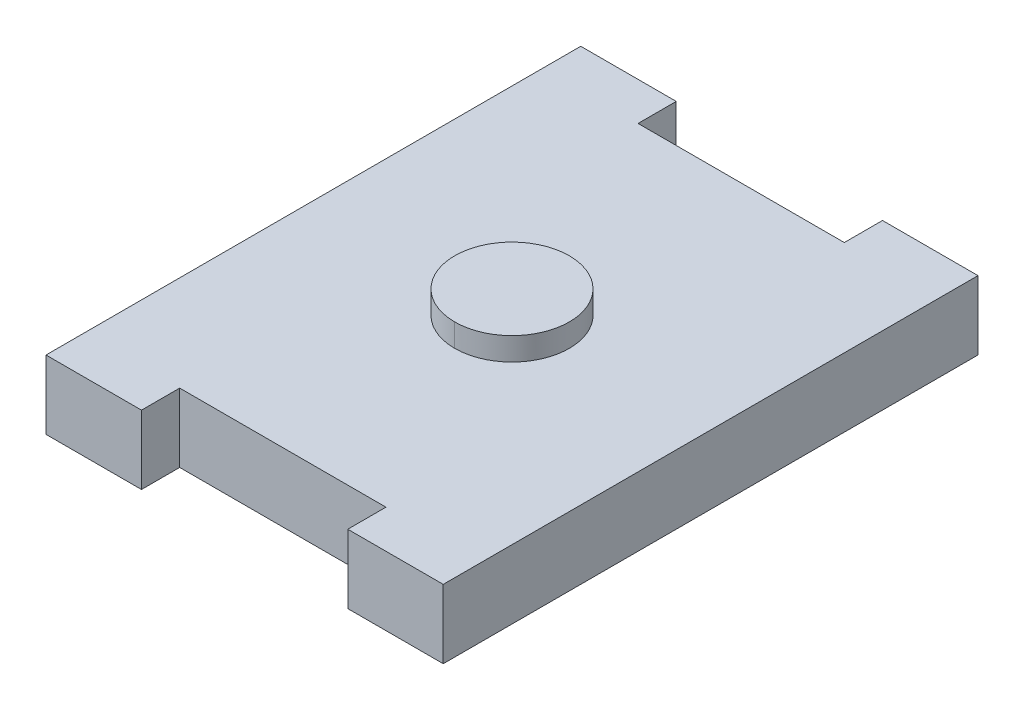
ISO-10303-21;
HEADER;
FILE_DESCRIPTION(('STEP AP214'),'2;1');
FILE_NAME('part.step','',(''),(''),'','','');
FILE_SCHEMA(('AUTOMOTIVE_DESIGN { 1 0 10303 214 1 1 1 1 }'));
ENDSEC;
DATA;
#1=APPLICATION_CONTEXT('core data for automotive mechanical design processes');
#2=APPLICATION_PROTOCOL_DEFINITION('international standard','automotive_design',2000,#1);
#3=PRODUCT_CONTEXT('',#1,'mechanical');
#4=PRODUCT('Part','Part','',(#3));
#5=PRODUCT_RELATED_PRODUCT_CATEGORY('part','',(#4));
#6=PRODUCT_DEFINITION_FORMATION('','',#4);
#7=PRODUCT_DEFINITION_CONTEXT('part definition',#1,'design');
#8=PRODUCT_DEFINITION('design','',#6,#7);
#9=PRODUCT_DEFINITION_SHAPE('','',#8);
#10=(LENGTH_UNIT() NAMED_UNIT(*) SI_UNIT(.MILLI.,.METRE.));
#11=(NAMED_UNIT(*) PLANE_ANGLE_UNIT() SI_UNIT($,.RADIAN.));
#12=(NAMED_UNIT(*) SI_UNIT($,.STERADIAN.) SOLID_ANGLE_UNIT());
#13=UNCERTAINTY_MEASURE_WITH_UNIT(LENGTH_MEASURE(1.E-05),#10,'distance_accuracy_value','');
#14=(GEOMETRIC_REPRESENTATION_CONTEXT(3) GLOBAL_UNCERTAINTY_ASSIGNED_CONTEXT((#13)) GLOBAL_UNIT_ASSIGNED_CONTEXT((#10,
#11,#12)) REPRESENTATION_CONTEXT('',''));
#15=CARTESIAN_POINT('',(0.,0.,0.));
#16=DIRECTION('',(0.,0.,1.));
#17=DIRECTION('',(1.,0.,0.));
#18=AXIS2_PLACEMENT_3D('',#15,#16,#17);
#19=CARTESIAN_POINT('',(-0.375,0.6,0.375));
#20=CARTESIAN_POINT('',(0.375,0.6,0.375));
#21=CARTESIAN_POINT('',(-0.375,0.6,-0.375));
#22=CARTESIAN_POINT('',(0.375,0.6,-0.375));
#23=(BOUNDED_SURFACE() B_SPLINE_SURFACE(1,1,((#19,#20),(#21,#22)),.UNSPECIFIED.,.F.,.F.,
.F.) B_SPLINE_SURFACE_WITH_KNOTS((2,2),(2,2),(-0.375,0.375),(-0.375,0.375),
.UNSPECIFIED.) GEOMETRIC_REPRESENTATION_ITEM() RATIONAL_B_SPLINE_SURFACE(((1.,1.),(1.,1.))) REPRESENTATION_ITEM('') SURFACE());
#24=CARTESIAN_POINT('',(0.,0.6,-0.375));
#25=CARTESIAN_POINT('',(0.375,0.6,-0.375));
#26=CARTESIAN_POINT('',(0.375,0.6,0.));
#27=CARTESIAN_POINT('',(0.375,0.6,0.375));
#28=CARTESIAN_POINT('',(0.,0.6,0.375));
#29=(BOUNDED_CURVE() B_SPLINE_CURVE(2,(#24,#25,#26,#27,#28),.UNSPECIFIED.,.F.,
.F.) B_SPLINE_CURVE_WITH_KNOTS((3,2,3),(0.,1.570796326795,3.14159265359),
.UNSPECIFIED.) CURVE() GEOMETRIC_REPRESENTATION_ITEM() RATIONAL_B_SPLINE_CURVE((1.,
0.707106781187,1.,0.707106781187,1.)) REPRESENTATION_ITEM(''));
#30=CARTESIAN_POINT('',(0.,0.6,-0.375));
#31=VERTEX_POINT('',#30);
#32=CARTESIAN_POINT('',(0.,0.6,0.375));
#33=VERTEX_POINT('',#32);
#34=EDGE_CURVE('E308',#31,#33,#29,.T.);
#35=CARTESIAN_POINT('',(0.,0.6,0.375));
#36=CARTESIAN_POINT('',(-0.375,0.6,0.375));
#37=CARTESIAN_POINT('',(-0.375,0.6,0.));
#38=CARTESIAN_POINT('',(-0.375,0.6,-0.375));
#39=CARTESIAN_POINT('',(0.,0.6,-0.375));
#40=(BOUNDED_CURVE() B_SPLINE_CURVE(2,(#35,#36,#37,#38,#39),.UNSPECIFIED.,.F.,
.F.) B_SPLINE_CURVE_WITH_KNOTS((3,2,3),(3.14159265359,4.712388980385,6.28318530718),
.UNSPECIFIED.) CURVE() GEOMETRIC_REPRESENTATION_ITEM() RATIONAL_B_SPLINE_CURVE((1.,
0.707106781187,1.,0.707106781187,1.)) REPRESENTATION_ITEM(''));
#41=EDGE_CURVE('E11',#33,#31,#40,.T.);
#42=ORIENTED_EDGE('',*,*,#34,.F.);
#43=ORIENTED_EDGE('',*,*,#41,.F.);
#44=EDGE_LOOP('',(#42,#43));
#45=FACE_BOUND('',#44,.T.);
#46=ADVANCED_FACE('F16',(#45),#23,.F.);
#47=CARTESIAN_POINT('',(0.,0.6,0.375));
#48=CARTESIAN_POINT('',(0.,0.45,0.375));
#49=CARTESIAN_POINT('',(-0.375,0.6,0.375));
#50=CARTESIAN_POINT('',(-0.375,0.45,0.375));
#51=CARTESIAN_POINT('',(-0.375,0.6,0.));
#52=CARTESIAN_POINT('',(-0.375,0.45,0.));
#53=CARTESIAN_POINT('',(-0.375,0.6,-0.375));
#54=CARTESIAN_POINT('',(-0.375,0.45,-0.375));
#55=CARTESIAN_POINT('',(0.,0.6,-0.375));
#56=CARTESIAN_POINT('',(0.,0.45,-0.375));
#57=(BOUNDED_SURFACE() B_SPLINE_SURFACE(2,1,((#47,#48),(#49,#50),(#51,#52),(#53,#54),(#55,#56)),
.UNSPECIFIED.,.F.,.F.,.F.) B_SPLINE_SURFACE_WITH_KNOTS((3,2,3),(2,2),(3.14159265359,
4.712388980385,6.28318530718),(1.66066017178,1.81066017178),
.UNSPECIFIED.) GEOMETRIC_REPRESENTATION_ITEM() RATIONAL_B_SPLINE_SURFACE(((1.,1.),
(0.707106781187,0.707106781187),(1.,1.),(0.707106781187,0.707106781187),(1.,1.))) REPRESENTATION_ITEM('') SURFACE());
#58=CARTESIAN_POINT('',(0.,0.6,0.375));
#59=CARTESIAN_POINT('',(0.,0.45,0.375));
#60=(BOUNDED_CURVE() B_SPLINE_CURVE(1,(#58,#59),.UNSPECIFIED.,.F.,
.F.) B_SPLINE_CURVE_WITH_KNOTS((2,2),(1.66066017178,1.81066017178),
.UNSPECIFIED.) CURVE() GEOMETRIC_REPRESENTATION_ITEM() RATIONAL_B_SPLINE_CURVE((1.,1.)) REPRESENTATION_ITEM(''));
#61=CARTESIAN_POINT('',(0.,0.45,0.375));
#62=VERTEX_POINT('',#61);
#63=EDGE_CURVE('E242',#33,#62,#60,.T.);
#64=CARTESIAN_POINT('',(0.,0.6,-0.375));
#65=CARTESIAN_POINT('',(0.,0.45,-0.375));
#66=(BOUNDED_CURVE() B_SPLINE_CURVE(1,(#64,#65),.UNSPECIFIED.,.F.,
.F.) B_SPLINE_CURVE_WITH_KNOTS((2,2),(1.66066017178,1.81066017178),
.UNSPECIFIED.) CURVE() GEOMETRIC_REPRESENTATION_ITEM() RATIONAL_B_SPLINE_CURVE((1.,1.)) REPRESENTATION_ITEM(''));
#67=CARTESIAN_POINT('',(0.,0.45,-0.375));
#68=VERTEX_POINT('',#67);
#69=EDGE_CURVE('E241',#31,#68,#66,.T.);
#70=CARTESIAN_POINT('',(0.,0.45,-0.375));
#71=CARTESIAN_POINT('',(-0.375,0.45,-0.375));
#72=CARTESIAN_POINT('',(-0.375,0.45,0.));
#73=CARTESIAN_POINT('',(-0.375,0.45,0.375));
#74=CARTESIAN_POINT('',(0.,0.45,0.375));
#75=(BOUNDED_CURVE() B_SPLINE_CURVE(2,(#70,#71,#72,#73,#74),.UNSPECIFIED.,.F.,
.F.) B_SPLINE_CURVE_WITH_KNOTS((3,2,3),(0.,1.570796326795,3.14159265359),
.UNSPECIFIED.) CURVE() GEOMETRIC_REPRESENTATION_ITEM() RATIONAL_B_SPLINE_CURVE((1.,
0.707106781187,1.,0.707106781187,1.)) REPRESENTATION_ITEM(''));
#76=EDGE_CURVE('E31',#68,#62,#75,.T.);
#77=ORIENTED_EDGE('',*,*,#63,.F.);
#78=ORIENTED_EDGE('',*,*,#41,.T.);
#79=ORIENTED_EDGE('',*,*,#69,.T.);
#80=ORIENTED_EDGE('',*,*,#76,.T.);
#81=EDGE_LOOP('',(#77,#78,#79,#80));
#82=FACE_BOUND('',#81,.T.);
#83=ADVANCED_FACE('F543',(#82),#57,.T.);
#84=CARTESIAN_POINT('',(-1.3,0.,1.75));
#85=CARTESIAN_POINT('',(1.3,0.,1.75));
#86=CARTESIAN_POINT('',(-1.3,0.,-1.75));
#87=CARTESIAN_POINT('',(1.3,0.,-1.75));
#88=(BOUNDED_SURFACE() B_SPLINE_SURFACE(1,1,((#84,#85),(#86,#87)),.UNSPECIFIED.,.F.,.F.,
.F.) B_SPLINE_SURFACE_WITH_KNOTS((2,2),(2,2),(-1.75,1.75),(-1.3,1.3),
.UNSPECIFIED.) GEOMETRIC_REPRESENTATION_ITEM() RATIONAL_B_SPLINE_SURFACE(((1.,1.),(1.,1.))) REPRESENTATION_ITEM('') SURFACE());
#89=CARTESIAN_POINT('',(1.3,0.,-1.75));
#90=CARTESIAN_POINT('',(0.675,0.,-1.75));
#91=(BOUNDED_CURVE() B_SPLINE_CURVE(1,(#89,#90),.UNSPECIFIED.,.F.,
.F.) B_SPLINE_CURVE_WITH_KNOTS((2,2),(-0.625,0.),
.UNSPECIFIED.) CURVE() GEOMETRIC_REPRESENTATION_ITEM() RATIONAL_B_SPLINE_CURVE((1.,1.)) REPRESENTATION_ITEM(''));
#92=CARTESIAN_POINT('',(1.3,0.,-1.75));
#93=VERTEX_POINT('',#92);
#94=CARTESIAN_POINT('',(0.675,0.,-1.75));
#95=VERTEX_POINT('',#94);
#96=EDGE_CURVE('E254',#93,#95,#91,.T.);
#97=CARTESIAN_POINT('',(1.3,0.,1.75));
#98=CARTESIAN_POINT('',(1.3,0.,-1.75));
#99=(BOUNDED_CURVE() B_SPLINE_CURVE(1,(#97,#98),.UNSPECIFIED.,.F.,
.F.) B_SPLINE_CURVE_WITH_KNOTS((2,2),(-3.5,0.),
.UNSPECIFIED.) CURVE() GEOMETRIC_REPRESENTATION_ITEM() RATIONAL_B_SPLINE_CURVE((1.,1.)) REPRESENTATION_ITEM(''));
#100=CARTESIAN_POINT('',(1.3,0.,1.75));
#101=VERTEX_POINT('',#100);
#102=EDGE_CURVE('E372',#101,#93,#99,.T.);
#103=CARTESIAN_POINT('',(0.675,0.,1.75));
#104=CARTESIAN_POINT('',(1.3,0.,1.75));
#105=(BOUNDED_CURVE() B_SPLINE_CURVE(1,(#103,#104),.UNSPECIFIED.,.F.,
.F.) B_SPLINE_CURVE_WITH_KNOTS((2,2),(0.,0.625),
.UNSPECIFIED.) CURVE() GEOMETRIC_REPRESENTATION_ITEM() RATIONAL_B_SPLINE_CURVE((1.,1.)) REPRESENTATION_ITEM(''));
#106=CARTESIAN_POINT('',(0.675,0.,1.75));
#107=VERTEX_POINT('',#106);
#108=EDGE_CURVE('E109',#107,#101,#105,.T.);
#109=CARTESIAN_POINT('',(0.675,0.,1.5));
#110=CARTESIAN_POINT('',(0.675,0.,1.75));
#111=(BOUNDED_CURVE() B_SPLINE_CURVE(1,(#109,#110),.UNSPECIFIED.,.F.,
.F.) B_SPLINE_CURVE_WITH_KNOTS((2,2),(0.,0.25),
.UNSPECIFIED.) CURVE() GEOMETRIC_REPRESENTATION_ITEM() RATIONAL_B_SPLINE_CURVE((1.,1.)) REPRESENTATION_ITEM(''));
#112=CARTESIAN_POINT('',(0.675,0.,1.5));
#113=VERTEX_POINT('',#112);
#114=EDGE_CURVE('E282',#113,#107,#111,.T.);
#115=CARTESIAN_POINT('',(-0.675,0.,1.5));
#116=CARTESIAN_POINT('',(0.675,0.,1.5));
#117=(BOUNDED_CURVE() B_SPLINE_CURVE(1,(#115,#116),.UNSPECIFIED.,.F.,
.F.) B_SPLINE_CURVE_WITH_KNOTS((2,2),(-1.35,0.),
.UNSPECIFIED.) CURVE() GEOMETRIC_REPRESENTATION_ITEM() RATIONAL_B_SPLINE_CURVE((1.,1.)) REPRESENTATION_ITEM(''));
#118=CARTESIAN_POINT('',(-0.675,0.,1.5));
#119=VERTEX_POINT('',#118);
#120=EDGE_CURVE('E149',#119,#113,#117,.T.);
#121=CARTESIAN_POINT('',(-0.675,0.,1.75));
#122=CARTESIAN_POINT('',(-0.675,0.,1.5));
#123=(BOUNDED_CURVE() B_SPLINE_CURVE(1,(#121,#122),.UNSPECIFIED.,.F.,
.F.) B_SPLINE_CURVE_WITH_KNOTS((2,2),(-0.25,0.),
.UNSPECIFIED.) CURVE() GEOMETRIC_REPRESENTATION_ITEM() RATIONAL_B_SPLINE_CURVE((1.,1.)) REPRESENTATION_ITEM(''));
#124=CARTESIAN_POINT('',(-0.675,0.,1.75));
#125=VERTEX_POINT('',#124);
#126=EDGE_CURVE('E429',#125,#119,#123,.T.);
#127=CARTESIAN_POINT('',(-1.3,0.,1.75));
#128=CARTESIAN_POINT('',(-0.675,0.,1.75));
#129=(BOUNDED_CURVE() B_SPLINE_CURVE(1,(#127,#128),.UNSPECIFIED.,.F.,
.F.) B_SPLINE_CURVE_WITH_KNOTS((2,2),(-0.625,0.),
.UNSPECIFIED.) CURVE() GEOMETRIC_REPRESENTATION_ITEM() RATIONAL_B_SPLINE_CURVE((1.,1.)) REPRESENTATION_ITEM(''));
#130=CARTESIAN_POINT('',(-1.3,0.,1.75));
#131=VERTEX_POINT('',#130);
#132=EDGE_CURVE('E199',#131,#125,#129,.T.);
#133=CARTESIAN_POINT('',(-1.3,0.,-1.75));
#134=CARTESIAN_POINT('',(-1.3,0.,1.75));
#135=(BOUNDED_CURVE() B_SPLINE_CURVE(1,(#133,#134),.UNSPECIFIED.,.F.,
.F.) B_SPLINE_CURVE_WITH_KNOTS((2,2),(0.,3.5),
.UNSPECIFIED.) CURVE() GEOMETRIC_REPRESENTATION_ITEM() RATIONAL_B_SPLINE_CURVE((1.,1.)) REPRESENTATION_ITEM(''));
#136=CARTESIAN_POINT('',(-1.3,0.,-1.75));
#137=VERTEX_POINT('',#136);
#138=EDGE_CURVE('E181',#137,#131,#135,.T.);
#139=CARTESIAN_POINT('',(-0.675,0.,-1.75));
#140=CARTESIAN_POINT('',(-1.3,0.,-1.75));
#141=(BOUNDED_CURVE() B_SPLINE_CURVE(1,(#139,#140),.UNSPECIFIED.,.F.,
.F.) B_SPLINE_CURVE_WITH_KNOTS((2,2),(0.,0.625),
.UNSPECIFIED.) CURVE() GEOMETRIC_REPRESENTATION_ITEM() RATIONAL_B_SPLINE_CURVE((1.,1.)) REPRESENTATION_ITEM(''));
#142=CARTESIAN_POINT('',(-0.675,0.,-1.75));
#143=VERTEX_POINT('',#142);
#144=EDGE_CURVE('E212',#143,#137,#141,.T.);
#145=CARTESIAN_POINT('',(-0.675,0.,-1.5));
#146=CARTESIAN_POINT('',(-0.675,0.,-1.75));
#147=(BOUNDED_CURVE() B_SPLINE_CURVE(1,(#145,#146),.UNSPECIFIED.,.F.,
.F.) B_SPLINE_CURVE_WITH_KNOTS((2,2),(0.,0.25),
.UNSPECIFIED.) CURVE() GEOMETRIC_REPRESENTATION_ITEM() RATIONAL_B_SPLINE_CURVE((1.,1.)) REPRESENTATION_ITEM(''));
#148=CARTESIAN_POINT('',(-0.675,0.,-1.5));
#149=VERTEX_POINT('',#148);
#150=EDGE_CURVE('E243',#149,#143,#147,.T.);
#151=CARTESIAN_POINT('',(0.675,0.,-1.5));
#152=CARTESIAN_POINT('',(-0.675,0.,-1.5));
#153=(BOUNDED_CURVE() B_SPLINE_CURVE(1,(#151,#152),.UNSPECIFIED.,.F.,
.F.) B_SPLINE_CURVE_WITH_KNOTS((2,2),(0.,1.35),
.UNSPECIFIED.) CURVE() GEOMETRIC_REPRESENTATION_ITEM() RATIONAL_B_SPLINE_CURVE((1.,1.)) REPRESENTATION_ITEM(''));
#154=CARTESIAN_POINT('',(0.675,0.,-1.5));
#155=VERTEX_POINT('',#154);
#156=EDGE_CURVE('E281',#155,#149,#153,.T.);
#157=CARTESIAN_POINT('',(0.675,0.,-1.75));
#158=CARTESIAN_POINT('',(0.675,0.,-1.5));
#159=(BOUNDED_CURVE() B_SPLINE_CURVE(1,(#157,#158),.UNSPECIFIED.,.F.,
.F.) B_SPLINE_CURVE_WITH_KNOTS((2,2),(-0.25,0.),
.UNSPECIFIED.) CURVE() GEOMETRIC_REPRESENTATION_ITEM() RATIONAL_B_SPLINE_CURVE((1.,1.)) REPRESENTATION_ITEM(''));
#160=EDGE_CURVE('E80',#95,#155,#159,.T.);
#161=ORIENTED_EDGE('',*,*,#96,.F.);
#162=ORIENTED_EDGE('',*,*,#102,.F.);
#163=ORIENTED_EDGE('',*,*,#108,.F.);
#164=ORIENTED_EDGE('',*,*,#114,.F.);
#165=ORIENTED_EDGE('',*,*,#120,.F.);
#166=ORIENTED_EDGE('',*,*,#126,.F.);
#167=ORIENTED_EDGE('',*,*,#132,.F.);
#168=ORIENTED_EDGE('',*,*,#138,.F.);
#169=ORIENTED_EDGE('',*,*,#144,.F.);
#170=ORIENTED_EDGE('',*,*,#150,.F.);
#171=ORIENTED_EDGE('',*,*,#156,.F.);
#172=ORIENTED_EDGE('',*,*,#160,.F.);
#173=EDGE_LOOP('',(#161,#162,#163,#164,#165,#166,#167,#168,#169,#170,#171,#172));
#174=FACE_BOUND('',#173,.T.);
#175=ADVANCED_FACE('F541',(#174),#88,.T.);
#176=CARTESIAN_POINT('',(-1.3,0.45,1.75));
#177=CARTESIAN_POINT('',(1.3,0.45,1.75));
#178=CARTESIAN_POINT('',(-1.3,0.45,-1.75));
#179=CARTESIAN_POINT('',(1.3,0.45,-1.75));
#180=(BOUNDED_SURFACE() B_SPLINE_SURFACE(1,1,((#176,#177),(#178,#179)),.UNSPECIFIED.,.F.,.F.,
.F.) B_SPLINE_SURFACE_WITH_KNOTS((2,2),(2,2),(-1.75,1.75),(-1.3,1.3),
.UNSPECIFIED.) GEOMETRIC_REPRESENTATION_ITEM() RATIONAL_B_SPLINE_SURFACE(((1.,1.),(1.,1.))) REPRESENTATION_ITEM('') SURFACE());
#181=CARTESIAN_POINT('',(1.3,0.45,-1.75));
#182=CARTESIAN_POINT('',(0.675,0.45,-1.75));
#183=(BOUNDED_CURVE() B_SPLINE_CURVE(1,(#181,#182),.UNSPECIFIED.,.F.,
.F.) B_SPLINE_CURVE_WITH_KNOTS((2,2),(-0.625,0.),
.UNSPECIFIED.) CURVE() GEOMETRIC_REPRESENTATION_ITEM() RATIONAL_B_SPLINE_CURVE((1.,1.)) REPRESENTATION_ITEM(''));
#184=CARTESIAN_POINT('',(1.3,0.45,-1.75));
#185=VERTEX_POINT('',#184);
#186=CARTESIAN_POINT('',(0.675,0.45,-1.75));
#187=VERTEX_POINT('',#186);
#188=EDGE_CURVE('E271',#185,#187,#183,.T.);
#189=CARTESIAN_POINT('',(0.675,0.45,-1.75));
#190=CARTESIAN_POINT('',(0.675,0.45,-1.5));
#191=(BOUNDED_CURVE() B_SPLINE_CURVE(1,(#189,#190),.UNSPECIFIED.,.F.,
.F.) B_SPLINE_CURVE_WITH_KNOTS((2,2),(-0.25,0.),
.UNSPECIFIED.) CURVE() GEOMETRIC_REPRESENTATION_ITEM() RATIONAL_B_SPLINE_CURVE((1.,1.)) REPRESENTATION_ITEM(''));
#192=CARTESIAN_POINT('',(0.675,0.45,-1.5));
#193=VERTEX_POINT('',#192);
#194=EDGE_CURVE('E64',#187,#193,#191,.T.);
#195=CARTESIAN_POINT('',(0.675,0.45,-1.5));
#196=CARTESIAN_POINT('',(-0.675,0.45,-1.5));
#197=(BOUNDED_CURVE() B_SPLINE_CURVE(1,(#195,#196),.UNSPECIFIED.,.F.,
.F.) B_SPLINE_CURVE_WITH_KNOTS((2,2),(0.,1.35),
.UNSPECIFIED.) CURVE() GEOMETRIC_REPRESENTATION_ITEM() RATIONAL_B_SPLINE_CURVE((1.,1.)) REPRESENTATION_ITEM(''));
#198=CARTESIAN_POINT('',(-0.675,0.45,-1.5));
#199=VERTEX_POINT('',#198);
#200=EDGE_CURVE('E253',#193,#199,#197,.T.);
#201=CARTESIAN_POINT('',(-0.675,0.45,-1.5));
#202=CARTESIAN_POINT('',(-0.675,0.45,-1.75));
#203=(BOUNDED_CURVE() B_SPLINE_CURVE(1,(#201,#202),.UNSPECIFIED.,.F.,
.F.) B_SPLINE_CURVE_WITH_KNOTS((2,2),(0.,0.25),
.UNSPECIFIED.) CURVE() GEOMETRIC_REPRESENTATION_ITEM() RATIONAL_B_SPLINE_CURVE((1.,1.)) REPRESENTATION_ITEM(''));
#204=CARTESIAN_POINT('',(-0.675,0.45,-1.75));
#205=VERTEX_POINT('',#204);
#206=EDGE_CURVE('E205',#199,#205,#203,.T.);
#207=CARTESIAN_POINT('',(-0.675,0.45,-1.75));
#208=CARTESIAN_POINT('',(-1.3,0.45,-1.75));
#209=(BOUNDED_CURVE() B_SPLINE_CURVE(1,(#207,#208),.UNSPECIFIED.,.F.,
.F.) B_SPLINE_CURVE_WITH_KNOTS((2,2),(0.,0.625),
.UNSPECIFIED.) CURVE() GEOMETRIC_REPRESENTATION_ITEM() RATIONAL_B_SPLINE_CURVE((1.,1.)) REPRESENTATION_ITEM(''));
#210=CARTESIAN_POINT('',(-1.3,0.45,-1.75));
#211=VERTEX_POINT('',#210);
#212=EDGE_CURVE('E202',#205,#211,#209,.T.);
#213=CARTESIAN_POINT('',(-1.3,0.45,-1.75));
#214=CARTESIAN_POINT('',(-1.3,0.45,1.75));
#215=(BOUNDED_CURVE() B_SPLINE_CURVE(1,(#213,#214),.UNSPECIFIED.,.F.,
.F.) B_SPLINE_CURVE_WITH_KNOTS((2,2),(0.,3.5),
.UNSPECIFIED.) CURVE() GEOMETRIC_REPRESENTATION_ITEM() RATIONAL_B_SPLINE_CURVE((1.,1.)) REPRESENTATION_ITEM(''));
#216=CARTESIAN_POINT('',(-1.3,0.45,1.75));
#217=VERTEX_POINT('',#216);
#218=EDGE_CURVE('E188',#211,#217,#215,.T.);
#219=CARTESIAN_POINT('',(-1.3,0.45,1.75));
#220=CARTESIAN_POINT('',(-0.675,0.45,1.75));
#221=(BOUNDED_CURVE() B_SPLINE_CURVE(1,(#219,#220),.UNSPECIFIED.,.F.,
.F.) B_SPLINE_CURVE_WITH_KNOTS((2,2),(-0.625,0.),
.UNSPECIFIED.) CURVE() GEOMETRIC_REPRESENTATION_ITEM() RATIONAL_B_SPLINE_CURVE((1.,1.)) REPRESENTATION_ITEM(''));
#222=CARTESIAN_POINT('',(-0.675,0.45,1.75));
#223=VERTEX_POINT('',#222);
#224=EDGE_CURVE('E346',#217,#223,#221,.T.);
#225=CARTESIAN_POINT('',(-0.675,0.45,1.75));
#226=CARTESIAN_POINT('',(-0.675,0.45,1.5));
#227=(BOUNDED_CURVE() B_SPLINE_CURVE(1,(#225,#226),.UNSPECIFIED.,.F.,
.F.) B_SPLINE_CURVE_WITH_KNOTS((2,2),(-0.25,0.),
.UNSPECIFIED.) CURVE() GEOMETRIC_REPRESENTATION_ITEM() RATIONAL_B_SPLINE_CURVE((1.,1.)) REPRESENTATION_ITEM(''));
#228=CARTESIAN_POINT('',(-0.675,0.45,1.5));
#229=VERTEX_POINT('',#228);
#230=EDGE_CURVE('E347',#223,#229,#227,.T.);
#231=CARTESIAN_POINT('',(-0.675,0.45,1.5));
#232=CARTESIAN_POINT('',(0.675,0.45,1.5));
#233=(BOUNDED_CURVE() B_SPLINE_CURVE(1,(#231,#232),.UNSPECIFIED.,.F.,
.F.) B_SPLINE_CURVE_WITH_KNOTS((2,2),(-1.35,0.),
.UNSPECIFIED.) CURVE() GEOMETRIC_REPRESENTATION_ITEM() RATIONAL_B_SPLINE_CURVE((1.,1.)) REPRESENTATION_ITEM(''));
#234=CARTESIAN_POINT('',(0.675,0.45,1.5));
#235=VERTEX_POINT('',#234);
#236=EDGE_CURVE('E22',#229,#235,#233,.T.);
#237=CARTESIAN_POINT('',(0.675,0.45,1.5));
#238=CARTESIAN_POINT('',(0.675,0.45,1.75));
#239=(BOUNDED_CURVE() B_SPLINE_CURVE(1,(#237,#238),.UNSPECIFIED.,.F.,
.F.) B_SPLINE_CURVE_WITH_KNOTS((2,2),(0.,0.25),
.UNSPECIFIED.) CURVE() GEOMETRIC_REPRESENTATION_ITEM() RATIONAL_B_SPLINE_CURVE((1.,1.)) REPRESENTATION_ITEM(''));
#240=CARTESIAN_POINT('',(0.675,0.45,1.75));
#241=VERTEX_POINT('',#240);
#242=EDGE_CURVE('E120',#235,#241,#239,.T.);
#243=CARTESIAN_POINT('',(0.675,0.45,1.75));
#244=CARTESIAN_POINT('',(1.3,0.45,1.75));
#245=(BOUNDED_CURVE() B_SPLINE_CURVE(1,(#243,#244),.UNSPECIFIED.,.F.,
.F.) B_SPLINE_CURVE_WITH_KNOTS((2,2),(0.,0.625),
.UNSPECIFIED.) CURVE() GEOMETRIC_REPRESENTATION_ITEM() RATIONAL_B_SPLINE_CURVE((1.,1.)) REPRESENTATION_ITEM(''));
#246=CARTESIAN_POINT('',(1.3,0.45,1.75));
#247=VERTEX_POINT('',#246);
#248=EDGE_CURVE('E102',#241,#247,#245,.T.);
#249=CARTESIAN_POINT('',(1.3,0.45,1.75));
#250=CARTESIAN_POINT('',(1.3,0.45,-1.75));
#251=(BOUNDED_CURVE() B_SPLINE_CURVE(1,(#249,#250),.UNSPECIFIED.,.F.,
.F.) B_SPLINE_CURVE_WITH_KNOTS((2,2),(-3.5,0.),
.UNSPECIFIED.) CURVE() GEOMETRIC_REPRESENTATION_ITEM() RATIONAL_B_SPLINE_CURVE((1.,1.)) REPRESENTATION_ITEM(''));
#252=EDGE_CURVE('E45',#247,#185,#251,.T.);
#253=CARTESIAN_POINT('',(0.,0.45,0.375));
#254=CARTESIAN_POINT('',(0.375,0.45,0.375));
#255=CARTESIAN_POINT('',(0.375,0.45,0.));
#256=CARTESIAN_POINT('',(0.375,0.45,-0.375));
#257=CARTESIAN_POINT('',(0.,0.45,-0.375));
#258=(BOUNDED_CURVE() B_SPLINE_CURVE(2,(#253,#254,#255,#256,#257),.UNSPECIFIED.,.F.,
.F.) B_SPLINE_CURVE_WITH_KNOTS((3,2,3),(3.14159265359,4.712388980385,6.28318530718),
.UNSPECIFIED.) CURVE() GEOMETRIC_REPRESENTATION_ITEM() RATIONAL_B_SPLINE_CURVE((1.,
0.707106781187,1.,0.707106781187,1.)) REPRESENTATION_ITEM(''));
#259=EDGE_CURVE('E232',#62,#68,#258,.T.);
#260=ORIENTED_EDGE('',*,*,#188,.T.);
#261=ORIENTED_EDGE('',*,*,#194,.T.);
#262=ORIENTED_EDGE('',*,*,#200,.T.);
#263=ORIENTED_EDGE('',*,*,#206,.T.);
#264=ORIENTED_EDGE('',*,*,#212,.T.);
#265=ORIENTED_EDGE('',*,*,#218,.T.);
#266=ORIENTED_EDGE('',*,*,#224,.T.);
#267=ORIENTED_EDGE('',*,*,#230,.T.);
#268=ORIENTED_EDGE('',*,*,#236,.T.);
#269=ORIENTED_EDGE('',*,*,#242,.T.);
#270=ORIENTED_EDGE('',*,*,#248,.T.);
#271=ORIENTED_EDGE('',*,*,#252,.T.);
#272=EDGE_LOOP('',(#260,#261,#262,#263,#264,#265,#266,#267,#268,#269,#270,#271));
#273=FACE_BOUND('',#272,.T.);
#274=ORIENTED_EDGE('',*,*,#76,.F.);
#275=ORIENTED_EDGE('',*,*,#259,.F.);
#276=EDGE_LOOP('',(#274,#275));
#277=FACE_BOUND('',#276,.T.);
#278=ADVANCED_FACE('F18',(#273,#277),#180,.F.);
#279=CARTESIAN_POINT('',(1.3,0.,-1.75));
#280=CARTESIAN_POINT('',(1.3,0.45,-1.75));
#281=CARTESIAN_POINT('',(1.3,0.,1.75));
#282=CARTESIAN_POINT('',(1.3,0.45,1.75));
#283=(BOUNDED_SURFACE() B_SPLINE_SURFACE(1,1,((#279,#280),(#281,#282)),.UNSPECIFIED.,.F.,.F.,
.F.) B_SPLINE_SURFACE_WITH_KNOTS((2,2),(2,2),(0.,3.5),(-0.45,0.),
.UNSPECIFIED.) GEOMETRIC_REPRESENTATION_ITEM() RATIONAL_B_SPLINE_SURFACE(((1.,1.),(1.,1.))) REPRESENTATION_ITEM('') SURFACE());
#284=CARTESIAN_POINT('',(1.3,0.45,-1.75));
#285=CARTESIAN_POINT('',(1.3,0.,-1.75));
#286=(BOUNDED_CURVE() B_SPLINE_CURVE(1,(#284,#285),.UNSPECIFIED.,.F.,
.F.) B_SPLINE_CURVE_WITH_KNOTS((2,2),(0.,0.45),
.UNSPECIFIED.) CURVE() GEOMETRIC_REPRESENTATION_ITEM() RATIONAL_B_SPLINE_CURVE((1.,1.)) REPRESENTATION_ITEM(''));
#287=EDGE_CURVE('E443',#185,#93,#286,.T.);
#288=CARTESIAN_POINT('',(1.3,0.45,1.75));
#289=CARTESIAN_POINT('',(1.3,0.,1.75));
#290=(BOUNDED_CURVE() B_SPLINE_CURVE(1,(#288,#289),.UNSPECIFIED.,.F.,
.F.) B_SPLINE_CURVE_WITH_KNOTS((2,2),(0.,0.45),
.UNSPECIFIED.) CURVE() GEOMETRIC_REPRESENTATION_ITEM() RATIONAL_B_SPLINE_CURVE((1.,1.)) REPRESENTATION_ITEM(''));
#291=EDGE_CURVE('E363',#247,#101,#290,.T.);
#292=ORIENTED_EDGE('',*,*,#102,.T.);
#293=ORIENTED_EDGE('',*,*,#287,.F.);
#294=ORIENTED_EDGE('',*,*,#252,.F.);
#295=ORIENTED_EDGE('',*,*,#291,.T.);
#296=EDGE_LOOP('',(#292,#293,#294,#295));
#297=FACE_BOUND('',#296,.T.);
#298=ADVANCED_FACE('F538',(#297),#283,.F.);
#299=CARTESIAN_POINT('',(1.3,0.,1.75));
#300=CARTESIAN_POINT('',(1.3,0.45,1.75));
#301=CARTESIAN_POINT('',(0.675,0.,1.75));
#302=CARTESIAN_POINT('',(0.675,0.45,1.75));
#303=(BOUNDED_SURFACE() B_SPLINE_SURFACE(1,1,((#299,#300),(#301,#302)),.UNSPECIFIED.,.F.,.F.,
.F.) B_SPLINE_SURFACE_WITH_KNOTS((2,2),(2,2),(-0.625,0.),(-0.45,0.),
.UNSPECIFIED.) GEOMETRIC_REPRESENTATION_ITEM() RATIONAL_B_SPLINE_SURFACE(((1.,1.),(1.,1.))) REPRESENTATION_ITEM('') SURFACE());
#304=CARTESIAN_POINT('',(0.675,0.45,1.75));
#305=CARTESIAN_POINT('',(0.675,0.,1.75));
#306=(BOUNDED_CURVE() B_SPLINE_CURVE(1,(#304,#305),.UNSPECIFIED.,.F.,
.F.) B_SPLINE_CURVE_WITH_KNOTS((2,2),(0.,0.45),
.UNSPECIFIED.) CURVE() GEOMETRIC_REPRESENTATION_ITEM() RATIONAL_B_SPLINE_CURVE((1.,1.)) REPRESENTATION_ITEM(''));
#307=EDGE_CURVE('E291',#241,#107,#306,.T.);
#308=ORIENTED_EDGE('',*,*,#108,.T.);
#309=ORIENTED_EDGE('',*,*,#291,.F.);
#310=ORIENTED_EDGE('',*,*,#248,.F.);
#311=ORIENTED_EDGE('',*,*,#307,.T.);
#312=EDGE_LOOP('',(#308,#309,#310,#311));
#313=FACE_BOUND('',#312,.T.);
#314=ADVANCED_FACE('F539',(#313),#303,.F.);
#315=CARTESIAN_POINT('',(0.675,0.,1.75));
#316=CARTESIAN_POINT('',(0.675,0.45,1.75));
#317=CARTESIAN_POINT('',(0.675,0.,1.5));
#318=CARTESIAN_POINT('',(0.675,0.45,1.5));
#319=(BOUNDED_SURFACE() B_SPLINE_SURFACE(1,1,((#315,#316),(#317,#318)),.UNSPECIFIED.,.F.,.F.,
.F.) B_SPLINE_SURFACE_WITH_KNOTS((2,2),(2,2),(-0.25,0.),(-0.45,0.),
.UNSPECIFIED.) GEOMETRIC_REPRESENTATION_ITEM() RATIONAL_B_SPLINE_SURFACE(((1.,1.),(1.,1.))) REPRESENTATION_ITEM('') SURFACE());
#320=CARTESIAN_POINT('',(0.675,0.45,1.5));
#321=CARTESIAN_POINT('',(0.675,0.,1.5));
#322=(BOUNDED_CURVE() B_SPLINE_CURVE(1,(#320,#321),.UNSPECIFIED.,.F.,
.F.) B_SPLINE_CURVE_WITH_KNOTS((2,2),(0.,0.45),
.UNSPECIFIED.) CURVE() GEOMETRIC_REPRESENTATION_ITEM() RATIONAL_B_SPLINE_CURVE((1.,1.)) REPRESENTATION_ITEM(''));
#323=EDGE_CURVE('E371',#235,#113,#322,.T.);
#324=ORIENTED_EDGE('',*,*,#114,.T.);
#325=ORIENTED_EDGE('',*,*,#307,.F.);
#326=ORIENTED_EDGE('',*,*,#242,.F.);
#327=ORIENTED_EDGE('',*,*,#323,.T.);
#328=EDGE_LOOP('',(#324,#325,#326,#327));
#329=FACE_BOUND('',#328,.T.);
#330=ADVANCED_FACE('F540',(#329),#319,.F.);
#331=CARTESIAN_POINT('',(0.675,0.,1.5));
#332=CARTESIAN_POINT('',(0.675,0.45,1.5));
#333=CARTESIAN_POINT('',(-0.675,0.,1.5));
#334=CARTESIAN_POINT('',(-0.675,0.45,1.5));
#335=(BOUNDED_SURFACE() B_SPLINE_SURFACE(1,1,((#331,#332),(#333,#334)),.UNSPECIFIED.,.F.,.F.,
.F.) B_SPLINE_SURFACE_WITH_KNOTS((2,2),(2,2),(0.,1.35),(-0.45,0.),
.UNSPECIFIED.) GEOMETRIC_REPRESENTATION_ITEM() RATIONAL_B_SPLINE_SURFACE(((1.,1.),(1.,1.))) REPRESENTATION_ITEM('') SURFACE());
#336=CARTESIAN_POINT('',(-0.675,0.45,1.5));
#337=CARTESIAN_POINT('',(-0.675,0.,1.5));
#338=(BOUNDED_CURVE() B_SPLINE_CURVE(1,(#336,#337),.UNSPECIFIED.,.F.,
.F.) B_SPLINE_CURVE_WITH_KNOTS((2,2),(0.,0.45),
.UNSPECIFIED.) CURVE() GEOMETRIC_REPRESENTATION_ITEM() RATIONAL_B_SPLINE_CURVE((1.,1.)) REPRESENTATION_ITEM(''));
#339=EDGE_CURVE('E355',#229,#119,#338,.T.);
#340=ORIENTED_EDGE('',*,*,#120,.T.);
#341=ORIENTED_EDGE('',*,*,#323,.F.);
#342=ORIENTED_EDGE('',*,*,#236,.F.);
#343=ORIENTED_EDGE('',*,*,#339,.T.);
#344=EDGE_LOOP('',(#340,#341,#342,#343));
#345=FACE_BOUND('',#344,.T.);
#346=ADVANCED_FACE('F610',(#345),#335,.F.);
#347=CARTESIAN_POINT('',(-0.675,0.,1.5));
#348=CARTESIAN_POINT('',(-0.675,0.45,1.5));
#349=CARTESIAN_POINT('',(-0.675,0.,1.75));
#350=CARTESIAN_POINT('',(-0.675,0.45,1.75));
#351=(BOUNDED_SURFACE() B_SPLINE_SURFACE(1,1,((#347,#348),(#349,#350)),.UNSPECIFIED.,.F.,.F.,
.F.) B_SPLINE_SURFACE_WITH_KNOTS((2,2),(2,2),(0.,0.25),(-0.45,0.),
.UNSPECIFIED.) GEOMETRIC_REPRESENTATION_ITEM() RATIONAL_B_SPLINE_SURFACE(((1.,1.),(1.,1.))) REPRESENTATION_ITEM('') SURFACE());
#352=CARTESIAN_POINT('',(-0.675,0.45,1.75));
#353=CARTESIAN_POINT('',(-0.675,0.,1.75));
#354=(BOUNDED_CURVE() B_SPLINE_CURVE(1,(#352,#353),.UNSPECIFIED.,.F.,
.F.) B_SPLINE_CURVE_WITH_KNOTS((2,2),(0.,0.45),
.UNSPECIFIED.) CURVE() GEOMETRIC_REPRESENTATION_ITEM() RATIONAL_B_SPLINE_CURVE((1.,1.)) REPRESENTATION_ITEM(''));
#355=EDGE_CURVE('E337',#223,#125,#354,.T.);
#356=ORIENTED_EDGE('',*,*,#126,.T.);
#357=ORIENTED_EDGE('',*,*,#339,.F.);
#358=ORIENTED_EDGE('',*,*,#230,.F.);
#359=ORIENTED_EDGE('',*,*,#355,.T.);
#360=EDGE_LOOP('',(#356,#357,#358,#359));
#361=FACE_BOUND('',#360,.T.);
#362=ADVANCED_FACE('F599',(#361),#351,.F.);
#363=CARTESIAN_POINT('',(-0.675,0.,1.75));
#364=CARTESIAN_POINT('',(-0.675,0.45,1.75));
#365=CARTESIAN_POINT('',(-1.3,0.,1.75));
#366=CARTESIAN_POINT('',(-1.3,0.45,1.75));
#367=(BOUNDED_SURFACE() B_SPLINE_SURFACE(1,1,((#363,#364),(#365,#366)),.UNSPECIFIED.,.F.,.F.,
.F.) B_SPLINE_SURFACE_WITH_KNOTS((2,2),(2,2),(0.,0.625),(-0.45,0.),
.UNSPECIFIED.) GEOMETRIC_REPRESENTATION_ITEM() RATIONAL_B_SPLINE_SURFACE(((1.,1.),(1.,1.))) REPRESENTATION_ITEM('') SURFACE());
#368=CARTESIAN_POINT('',(-1.3,0.45,1.75));
#369=CARTESIAN_POINT('',(-1.3,0.,1.75));
#370=(BOUNDED_CURVE() B_SPLINE_CURVE(1,(#368,#369),.UNSPECIFIED.,.F.,
.F.) B_SPLINE_CURVE_WITH_KNOTS((2,2),(0.,0.45),
.UNSPECIFIED.) CURVE() GEOMETRIC_REPRESENTATION_ITEM() RATIONAL_B_SPLINE_CURVE((1.,1.)) REPRESENTATION_ITEM(''));
#371=EDGE_CURVE('E195',#217,#131,#370,.T.);
#372=ORIENTED_EDGE('',*,*,#132,.T.);
#373=ORIENTED_EDGE('',*,*,#355,.F.);
#374=ORIENTED_EDGE('',*,*,#224,.F.);
#375=ORIENTED_EDGE('',*,*,#371,.T.);
#376=EDGE_LOOP('',(#372,#373,#374,#375));
#377=FACE_BOUND('',#376,.T.);
#378=ADVANCED_FACE('F609',(#377),#367,.F.);
#379=CARTESIAN_POINT('',(-1.3,0.,1.75));
#380=CARTESIAN_POINT('',(-1.3,0.45,1.75));
#381=CARTESIAN_POINT('',(-1.3,0.,-1.75));
#382=CARTESIAN_POINT('',(-1.3,0.45,-1.75));
#383=(BOUNDED_SURFACE() B_SPLINE_SURFACE(1,1,((#379,#380),(#381,#382)),.UNSPECIFIED.,.F.,.F.,
.F.) B_SPLINE_SURFACE_WITH_KNOTS((2,2),(2,2),(-3.5,0.),(-0.45,0.),
.UNSPECIFIED.) GEOMETRIC_REPRESENTATION_ITEM() RATIONAL_B_SPLINE_SURFACE(((1.,1.),(1.,1.))) REPRESENTATION_ITEM('') SURFACE());
#384=CARTESIAN_POINT('',(-1.3,0.45,-1.75));
#385=CARTESIAN_POINT('',(-1.3,0.,-1.75));
#386=(BOUNDED_CURVE() B_SPLINE_CURVE(1,(#384,#385),.UNSPECIFIED.,.F.,
.F.) B_SPLINE_CURVE_WITH_KNOTS((2,2),(0.,0.45),
.UNSPECIFIED.) CURVE() GEOMETRIC_REPRESENTATION_ITEM() RATIONAL_B_SPLINE_CURVE((1.,1.)) REPRESENTATION_ITEM(''));
#387=EDGE_CURVE('E192',#211,#137,#386,.T.);
#388=ORIENTED_EDGE('',*,*,#138,.T.);
#389=ORIENTED_EDGE('',*,*,#371,.F.);
#390=ORIENTED_EDGE('',*,*,#218,.F.);
#391=ORIENTED_EDGE('',*,*,#387,.T.);
#392=EDGE_LOOP('',(#388,#389,#390,#391));
#393=FACE_BOUND('',#392,.T.);
#394=ADVANCED_FACE('F190',(#393),#383,.F.);
#395=CARTESIAN_POINT('',(-1.3,0.,-1.75));
#396=CARTESIAN_POINT('',(-1.3,0.45,-1.75));
#397=CARTESIAN_POINT('',(-0.675,0.,-1.75));
#398=CARTESIAN_POINT('',(-0.675,0.45,-1.75));
#399=(BOUNDED_SURFACE() B_SPLINE_SURFACE(1,1,((#395,#396),(#397,#398)),.UNSPECIFIED.,.F.,.F.,
.F.) B_SPLINE_SURFACE_WITH_KNOTS((2,2),(2,2),(-0.625,0.),(-0.45,0.),
.UNSPECIFIED.) GEOMETRIC_REPRESENTATION_ITEM() RATIONAL_B_SPLINE_SURFACE(((1.,1.),(1.,1.))) REPRESENTATION_ITEM('') SURFACE());
#400=CARTESIAN_POINT('',(-0.675,0.45,-1.75));
#401=CARTESIAN_POINT('',(-0.675,0.,-1.75));
#402=(BOUNDED_CURVE() B_SPLINE_CURVE(1,(#400,#401),.UNSPECIFIED.,.F.,
.F.) B_SPLINE_CURVE_WITH_KNOTS((2,2),(0.,0.45),
.UNSPECIFIED.) CURVE() GEOMETRIC_REPRESENTATION_ITEM() RATIONAL_B_SPLINE_CURVE((1.,1.)) REPRESENTATION_ITEM(''));
#403=EDGE_CURVE('E252',#205,#143,#402,.T.);
#404=ORIENTED_EDGE('',*,*,#144,.T.);
#405=ORIENTED_EDGE('',*,*,#387,.F.);
#406=ORIENTED_EDGE('',*,*,#212,.F.);
#407=ORIENTED_EDGE('',*,*,#403,.T.);
#408=EDGE_LOOP('',(#404,#405,#406,#407));
#409=FACE_BOUND('',#408,.T.);
#410=ADVANCED_FACE('F211',(#409),#399,.F.);
#411=CARTESIAN_POINT('',(-0.675,0.,-1.75));
#412=CARTESIAN_POINT('',(-0.675,0.45,-1.75));
#413=CARTESIAN_POINT('',(-0.675,0.,-1.5));
#414=CARTESIAN_POINT('',(-0.675,0.45,-1.5));
#415=(BOUNDED_SURFACE() B_SPLINE_SURFACE(1,1,((#411,#412),(#413,#414)),.UNSPECIFIED.,.F.,.F.,
.F.) B_SPLINE_SURFACE_WITH_KNOTS((2,2),(2,2),(-0.25,0.),(-0.45,0.),
.UNSPECIFIED.) GEOMETRIC_REPRESENTATION_ITEM() RATIONAL_B_SPLINE_SURFACE(((1.,1.),(1.,1.))) REPRESENTATION_ITEM('') SURFACE());
#416=CARTESIAN_POINT('',(-0.675,0.45,-1.5));
#417=CARTESIAN_POINT('',(-0.675,0.,-1.5));
#418=(BOUNDED_CURVE() B_SPLINE_CURVE(1,(#416,#417),.UNSPECIFIED.,.F.,
.F.) B_SPLINE_CURVE_WITH_KNOTS((2,2),(0.,0.45),
.UNSPECIFIED.) CURVE() GEOMETRIC_REPRESENTATION_ITEM() RATIONAL_B_SPLINE_CURVE((1.,1.)) REPRESENTATION_ITEM(''));
#419=EDGE_CURVE('E272',#199,#149,#418,.T.);
#420=ORIENTED_EDGE('',*,*,#150,.T.);
#421=ORIENTED_EDGE('',*,*,#403,.F.);
#422=ORIENTED_EDGE('',*,*,#206,.F.);
#423=ORIENTED_EDGE('',*,*,#419,.T.);
#424=EDGE_LOOP('',(#420,#421,#422,#423));
#425=FACE_BOUND('',#424,.T.);
#426=ADVANCED_FACE('F566',(#425),#415,.F.);
#427=CARTESIAN_POINT('',(-0.675,0.,-1.5));
#428=CARTESIAN_POINT('',(-0.675,0.45,-1.5));
#429=CARTESIAN_POINT('',(0.675,0.,-1.5));
#430=CARTESIAN_POINT('',(0.675,0.45,-1.5));
#431=(BOUNDED_SURFACE() B_SPLINE_SURFACE(1,1,((#427,#428),(#429,#430)),.UNSPECIFIED.,.F.,.F.,
.F.) B_SPLINE_SURFACE_WITH_KNOTS((2,2),(2,2),(-1.35,0.),(-0.45,0.),
.UNSPECIFIED.) GEOMETRIC_REPRESENTATION_ITEM() RATIONAL_B_SPLINE_SURFACE(((1.,1.),(1.,1.))) REPRESENTATION_ITEM('') SURFACE());
#432=CARTESIAN_POINT('',(0.675,0.45,-1.5));
#433=CARTESIAN_POINT('',(0.675,0.,-1.5));
#434=(BOUNDED_CURVE() B_SPLINE_CURVE(1,(#432,#433),.UNSPECIFIED.,.F.,
.F.) B_SPLINE_CURVE_WITH_KNOTS((2,2),(0.,0.45),
.UNSPECIFIED.) CURVE() GEOMETRIC_REPRESENTATION_ITEM() RATIONAL_B_SPLINE_CURVE((1.,1.)) REPRESENTATION_ITEM(''));
#435=EDGE_CURVE('E292',#193,#155,#434,.T.);
#436=ORIENTED_EDGE('',*,*,#156,.T.);
#437=ORIENTED_EDGE('',*,*,#419,.F.);
#438=ORIENTED_EDGE('',*,*,#200,.F.);
#439=ORIENTED_EDGE('',*,*,#435,.T.);
#440=EDGE_LOOP('',(#436,#437,#438,#439));
#441=FACE_BOUND('',#440,.T.);
#442=ADVANCED_FACE('F570',(#441),#431,.F.);
#443=CARTESIAN_POINT('',(0.675,0.,-1.5));
#444=CARTESIAN_POINT('',(0.675,0.45,-1.5));
#445=CARTESIAN_POINT('',(0.675,0.,-1.75));
#446=CARTESIAN_POINT('',(0.675,0.45,-1.75));
#447=(BOUNDED_SURFACE() B_SPLINE_SURFACE(1,1,((#443,#444),(#445,#446)),.UNSPECIFIED.,.F.,.F.,
.F.) B_SPLINE_SURFACE_WITH_KNOTS((2,2),(2,2),(0.,0.25),(-0.45,0.),
.UNSPECIFIED.) GEOMETRIC_REPRESENTATION_ITEM() RATIONAL_B_SPLINE_SURFACE(((1.,1.),(1.,1.))) REPRESENTATION_ITEM('') SURFACE());
#448=CARTESIAN_POINT('',(0.675,0.45,-1.75));
#449=CARTESIAN_POINT('',(0.675,0.,-1.75));
#450=(BOUNDED_CURVE() B_SPLINE_CURVE(1,(#448,#449),.UNSPECIFIED.,.F.,
.F.) B_SPLINE_CURVE_WITH_KNOTS((2,2),(0.,0.45),
.UNSPECIFIED.) CURVE() GEOMETRIC_REPRESENTATION_ITEM() RATIONAL_B_SPLINE_CURVE((1.,1.)) REPRESENTATION_ITEM(''));
#451=EDGE_CURVE('E263',#187,#95,#450,.T.);
#452=ORIENTED_EDGE('',*,*,#160,.T.);
#453=ORIENTED_EDGE('',*,*,#435,.F.);
#454=ORIENTED_EDGE('',*,*,#194,.F.);
#455=ORIENTED_EDGE('',*,*,#451,.T.);
#456=EDGE_LOOP('',(#452,#453,#454,#455));
#457=FACE_BOUND('',#456,.T.);
#458=ADVANCED_FACE('F580',(#457),#447,.F.);
#459=CARTESIAN_POINT('',(0.675,0.,-1.75));
#460=CARTESIAN_POINT('',(0.675,0.45,-1.75));
#461=CARTESIAN_POINT('',(1.3,0.,-1.75));
#462=CARTESIAN_POINT('',(1.3,0.45,-1.75));
#463=(BOUNDED_SURFACE() B_SPLINE_SURFACE(1,1,((#459,#460),(#461,#462)),.UNSPECIFIED.,.F.,.F.,
.F.) B_SPLINE_SURFACE_WITH_KNOTS((2,2),(2,2),(0.,0.625),(-0.45,0.),
.UNSPECIFIED.) GEOMETRIC_REPRESENTATION_ITEM() RATIONAL_B_SPLINE_SURFACE(((1.,1.),(1.,1.))) REPRESENTATION_ITEM('') SURFACE());
#464=ORIENTED_EDGE('',*,*,#96,.T.);
#465=ORIENTED_EDGE('',*,*,#451,.F.);
#466=ORIENTED_EDGE('',*,*,#188,.F.);
#467=ORIENTED_EDGE('',*,*,#287,.T.);
#468=EDGE_LOOP('',(#464,#465,#466,#467));
#469=FACE_BOUND('',#468,.T.);
#470=ADVANCED_FACE('F590',(#469),#463,.F.);
#471=CARTESIAN_POINT('',(0.,0.6,-0.375));
#472=CARTESIAN_POINT('',(0.,0.45,-0.375));
#473=CARTESIAN_POINT('',(0.375,0.6,-0.375));
#474=CARTESIAN_POINT('',(0.375,0.45,-0.375));
#475=CARTESIAN_POINT('',(0.375,0.6,0.));
#476=CARTESIAN_POINT('',(0.375,0.45,0.));
#477=CARTESIAN_POINT('',(0.375,0.6,0.375));
#478=CARTESIAN_POINT('',(0.375,0.45,0.375));
#479=CARTESIAN_POINT('',(0.,0.6,0.375));
#480=CARTESIAN_POINT('',(0.,0.45,0.375));
#481=(BOUNDED_SURFACE() B_SPLINE_SURFACE(2,1,((#471,#472),(#473,#474),(#475,#476),(#477,#478),
(#479,#480)),.UNSPECIFIED.,.F.,.F.,.F.) B_SPLINE_SURFACE_WITH_KNOTS((3,2,3),(2,2),(0.,
1.570796326795,3.14159265359),(1.66066017178,1.81066017178),
.UNSPECIFIED.) GEOMETRIC_REPRESENTATION_ITEM() RATIONAL_B_SPLINE_SURFACE(((1.,1.),
(0.707106781187,0.707106781187),(1.,1.),(0.707106781187,0.707106781187),(1.,1.))) REPRESENTATION_ITEM('') SURFACE());
#482=ORIENTED_EDGE('',*,*,#34,.T.);
#483=ORIENTED_EDGE('',*,*,#63,.T.);
#484=ORIENTED_EDGE('',*,*,#259,.T.);
#485=ORIENTED_EDGE('',*,*,#69,.F.);
#486=EDGE_LOOP('',(#482,#483,#484,#485));
#487=FACE_BOUND('',#486,.T.);
#488=ADVANCED_FACE('F739',(#487),#481,.T.);
#489=CLOSED_SHELL('',(#46,#83,#175,#278,#298,#314,#330,#346,#362,#378,#394,#410,#426,#442,#458,
#470,#488));
#490=MANIFOLD_SOLID_BREP('B1',#489);
#491=ADVANCED_BREP_SHAPE_REPRESENTATION('',(#18,#490),#14);
#492=SHAPE_DEFINITION_REPRESENTATION(#9,#491);
ENDSEC;
END-ISO-10303-21;
